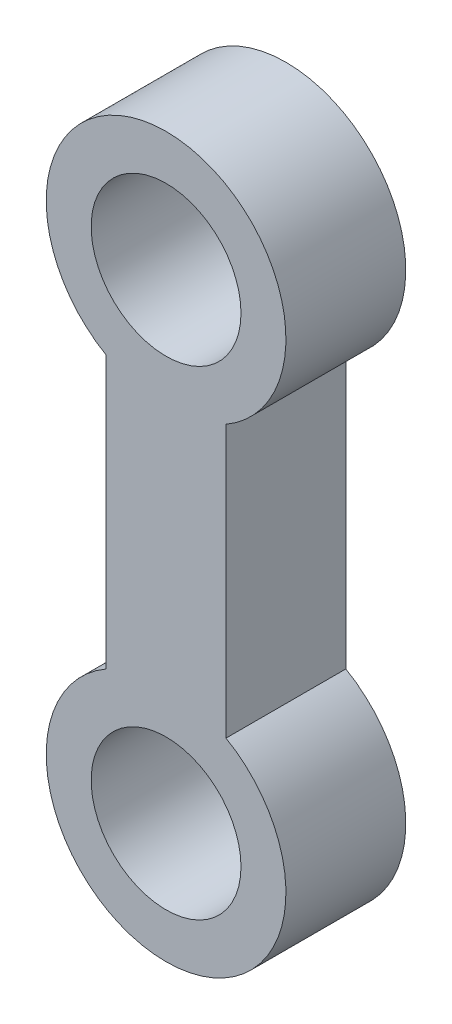
ISO-10303-21;
HEADER;
FILE_DESCRIPTION(('STEP AP214'),'2;1');
FILE_NAME('part.step','',(''),(''),'','','');
FILE_SCHEMA(('AUTOMOTIVE_DESIGN { 1 0 10303 214 1 1 1 1 }'));
ENDSEC;
DATA;
#1=APPLICATION_CONTEXT('core data for automotive mechanical design processes');
#2=APPLICATION_PROTOCOL_DEFINITION('international standard','automotive_design',2000,#1);
#3=PRODUCT_CONTEXT('',#1,'mechanical');
#4=PRODUCT('Part','Part','',(#3));
#5=PRODUCT_RELATED_PRODUCT_CATEGORY('part','',(#4));
#6=PRODUCT_DEFINITION_FORMATION('','',#4);
#7=PRODUCT_DEFINITION_CONTEXT('part definition',#1,'design');
#8=PRODUCT_DEFINITION('design','',#6,#7);
#9=PRODUCT_DEFINITION_SHAPE('','',#8);
#10=(LENGTH_UNIT() NAMED_UNIT(*) SI_UNIT(.MILLI.,.METRE.));
#11=(NAMED_UNIT(*) PLANE_ANGLE_UNIT() SI_UNIT($,.RADIAN.));
#12=(NAMED_UNIT(*) SI_UNIT($,.STERADIAN.) SOLID_ANGLE_UNIT());
#13=UNCERTAINTY_MEASURE_WITH_UNIT(LENGTH_MEASURE(1.E-05),#10,'distance_accuracy_value','');
#14=(GEOMETRIC_REPRESENTATION_CONTEXT(3) GLOBAL_UNCERTAINTY_ASSIGNED_CONTEXT((#13)) GLOBAL_UNIT_ASSIGNED_CONTEXT((#10,
#11,#12)) REPRESENTATION_CONTEXT('',''));
#15=CARTESIAN_POINT('',(0.,0.,0.));
#16=DIRECTION('',(0.,0.,1.));
#17=DIRECTION('',(1.,0.,0.));
#18=AXIS2_PLACEMENT_3D('',#15,#16,#17);
#19=CARTESIAN_POINT('',(-5.,0.,10.));
#20=DIRECTION('',(-1.,0.,0.));
#21=DIRECTION('',(0.,0.,1.));
#22=AXIS2_PLACEMENT_3D('',#19,#20,#21);
#23=PLANE('',#22);
#24=DIRECTION('',(0.,1.,0.));
#25=VECTOR('',#24,1.);
#26=CARTESIAN_POINT('',(-5.,0.,0.));
#27=LINE('',#26,#25);
#28=CARTESIAN_POINT('',(-5.,8.66025403784439,0.));
#29=VERTEX_POINT('',#28);
#30=CARTESIAN_POINT('',(-5.,31.3397459621556,0.));
#31=VERTEX_POINT('',#30);
#32=EDGE_CURVE('E114',#29,#31,#27,.T.);
#33=ORIENTED_EDGE('',*,*,#32,.F.);
#34=DIRECTION('',(0.,0.,-1.));
#35=VECTOR('',#34,1.);
#36=CARTESIAN_POINT('',(-5.,8.66025403784439,10.));
#37=LINE('',#36,#35);
#38=CARTESIAN_POINT('',(-5.,8.66025403784439,10.));
#39=VERTEX_POINT('',#38);
#40=EDGE_CURVE('E11',#39,#29,#37,.T.);
#41=ORIENTED_EDGE('',*,*,#40,.F.);
#42=DIRECTION('',(0.,1.,0.));
#43=VECTOR('',#42,1.);
#44=CARTESIAN_POINT('',(-5.,0.,10.));
#45=LINE('',#44,#43);
#46=CARTESIAN_POINT('',(-5.,31.3397459621556,10.));
#47=VERTEX_POINT('',#46);
#48=EDGE_CURVE('E98',#39,#47,#45,.T.);
#49=ORIENTED_EDGE('',*,*,#48,.T.);
#50=DIRECTION('',(0.,0.,-1.));
#51=VECTOR('',#50,1.);
#52=CARTESIAN_POINT('',(-5.,31.3397459621556,10.));
#53=LINE('',#52,#51);
#54=EDGE_CURVE('E87',#47,#31,#53,.T.);
#55=ORIENTED_EDGE('',*,*,#54,.T.);
#56=EDGE_LOOP('',(#33,#41,#49,#55));
#57=FACE_BOUND('',#56,.T.);
#58=ADVANCED_FACE('F47',(#57),#23,.T.);
#59=CARTESIAN_POINT('',(0.,0.,10.));
#60=DIRECTION('',(0.,0.,-1.));
#61=DIRECTION('',(-1.,0.,0.));
#62=AXIS2_PLACEMENT_3D('',#59,#60,#61);
#63=CYLINDRICAL_SURFACE('',#62,10.);
#64=CARTESIAN_POINT('',(0.,0.,0.));
#65=DIRECTION('',(0.,0.,1.));
#66=DIRECTION('',(1.,0.,0.));
#67=AXIS2_PLACEMENT_3D('',#64,#65,#66);
#68=CIRCLE('',#67,10.);
#69=CARTESIAN_POINT('',(5.,8.66025403784439,0.));
#70=VERTEX_POINT('',#69);
#71=EDGE_CURVE('E104',#29,#70,#68,.T.);
#72=ORIENTED_EDGE('',*,*,#71,.T.);
#73=DIRECTION('',(0.,0.,-1.));
#74=VECTOR('',#73,1.);
#75=CARTESIAN_POINT('',(5.,8.66025403784439,10.));
#76=LINE('',#75,#74);
#77=CARTESIAN_POINT('',(5.,8.66025403784439,10.));
#78=VERTEX_POINT('',#77);
#79=EDGE_CURVE('E56',#78,#70,#76,.T.);
#80=ORIENTED_EDGE('',*,*,#79,.F.);
#81=CARTESIAN_POINT('',(0.,0.,10.));
#82=DIRECTION('',(0.,0.,1.));
#83=DIRECTION('',(1.,0.,0.));
#84=AXIS2_PLACEMENT_3D('',#81,#82,#83);
#85=CIRCLE('',#84,10.);
#86=EDGE_CURVE('E93',#39,#78,#85,.T.);
#87=ORIENTED_EDGE('',*,*,#86,.F.);
#88=ORIENTED_EDGE('',*,*,#40,.T.);
#89=EDGE_LOOP('',(#72,#80,#87,#88));
#90=FACE_BOUND('',#89,.T.);
#91=ADVANCED_FACE('F102',(#90),#63,.T.);
#92=CARTESIAN_POINT('',(5.,0.,10.));
#93=DIRECTION('',(-1.,0.,0.));
#94=DIRECTION('',(0.,-1.,0.));
#95=AXIS2_PLACEMENT_3D('',#92,#93,#94);
#96=PLANE('',#95);
#97=DIRECTION('',(0.,1.,0.));
#98=VECTOR('',#97,1.);
#99=CARTESIAN_POINT('',(5.,0.,0.));
#100=LINE('',#99,#98);
#101=CARTESIAN_POINT('',(5.,31.3397459621556,0.));
#102=VERTEX_POINT('',#101);
#103=EDGE_CURVE('E80',#70,#102,#100,.T.);
#104=ORIENTED_EDGE('',*,*,#103,.T.);
#105=DIRECTION('',(0.,0.,-1.));
#106=VECTOR('',#105,1.);
#107=CARTESIAN_POINT('',(5.,31.3397459621556,10.));
#108=LINE('',#107,#106);
#109=CARTESIAN_POINT('',(5.,31.3397459621556,10.));
#110=VERTEX_POINT('',#109);
#111=EDGE_CURVE('E106',#110,#102,#108,.T.);
#112=ORIENTED_EDGE('',*,*,#111,.F.);
#113=DIRECTION('',(0.,1.,0.));
#114=VECTOR('',#113,1.);
#115=CARTESIAN_POINT('',(5.,0.,10.));
#116=LINE('',#115,#114);
#117=EDGE_CURVE('E97',#78,#110,#116,.T.);
#118=ORIENTED_EDGE('',*,*,#117,.F.);
#119=ORIENTED_EDGE('',*,*,#79,.T.);
#120=EDGE_LOOP('',(#104,#112,#118,#119));
#121=FACE_BOUND('',#120,.T.);
#122=ADVANCED_FACE('F107',(#121),#96,.F.);
#123=CARTESIAN_POINT('',(0.,40.,10.));
#124=DIRECTION('',(0.,0.,-1.));
#125=DIRECTION('',(-1.,0.,0.));
#126=AXIS2_PLACEMENT_3D('',#123,#124,#125);
#127=CYLINDRICAL_SURFACE('',#126,10.);
#128=CARTESIAN_POINT('',(0.,40.,0.));
#129=DIRECTION('',(0.,0.,1.));
#130=DIRECTION('',(1.,0.,0.));
#131=AXIS2_PLACEMENT_3D('',#128,#129,#130);
#132=CIRCLE('',#131,10.);
#133=EDGE_CURVE('E123',#102,#31,#132,.T.);
#134=ORIENTED_EDGE('',*,*,#133,.T.);
#135=ORIENTED_EDGE('',*,*,#54,.F.);
#136=CARTESIAN_POINT('',(0.,40.,10.));
#137=DIRECTION('',(0.,0.,1.));
#138=DIRECTION('',(1.,0.,0.));
#139=AXIS2_PLACEMENT_3D('',#136,#137,#138);
#140=CIRCLE('',#139,10.);
#141=EDGE_CURVE('E64',#110,#47,#140,.T.);
#142=ORIENTED_EDGE('',*,*,#141,.F.);
#143=ORIENTED_EDGE('',*,*,#111,.T.);
#144=EDGE_LOOP('',(#134,#135,#142,#143));
#145=FACE_BOUND('',#144,.T.);
#146=ADVANCED_FACE('F131',(#145),#127,.T.);
#147=CARTESIAN_POINT('',(0.,0.,10.));
#148=DIRECTION('',(0.,0.,1.));
#149=DIRECTION('',(1.,0.,0.));
#150=AXIS2_PLACEMENT_3D('',#147,#148,#149);
#151=PLANE('',#150);
#152=CARTESIAN_POINT('',(0.,40.,10.));
#153=DIRECTION('',(0.,0.,1.));
#154=DIRECTION('',(1.,0.,0.));
#155=AXIS2_PLACEMENT_3D('',#152,#153,#154);
#156=CIRCLE('',#155,6.25);
#157=CARTESIAN_POINT('',(6.25,40.,10.));
#158=VERTEX_POINT('',#157);
#159=EDGE_CURVE('E165',#158,#158,#156,.T.);
#160=ORIENTED_EDGE('',*,*,#159,.F.);
#161=EDGE_LOOP('',(#160));
#162=FACE_BOUND('',#161,.T.);
#163=CARTESIAN_POINT('',(0.,0.,10.));
#164=DIRECTION('',(0.,0.,1.));
#165=DIRECTION('',(1.,0.,0.));
#166=AXIS2_PLACEMENT_3D('',#163,#164,#165);
#167=CIRCLE('',#166,6.25);
#168=CARTESIAN_POINT('',(6.25,0.,10.));
#169=VERTEX_POINT('',#168);
#170=EDGE_CURVE('E167',#169,#169,#167,.T.);
#171=ORIENTED_EDGE('',*,*,#170,.F.);
#172=EDGE_LOOP('',(#171));
#173=FACE_BOUND('',#172,.T.);
#174=ORIENTED_EDGE('',*,*,#48,.F.);
#175=ORIENTED_EDGE('',*,*,#86,.T.);
#176=ORIENTED_EDGE('',*,*,#117,.T.);
#177=ORIENTED_EDGE('',*,*,#141,.T.);
#178=EDGE_LOOP('',(#174,#175,#176,#177));
#179=FACE_BOUND('',#178,.T.);
#180=ADVANCED_FACE('F95',(#162,#173,#179),#151,.T.);
#181=CARTESIAN_POINT('',(0.,0.,0.));
#182=DIRECTION('',(0.,0.,1.));
#183=DIRECTION('',(1.,0.,0.));
#184=AXIS2_PLACEMENT_3D('',#181,#182,#183);
#185=PLANE('',#184);
#186=CARTESIAN_POINT('',(0.,40.,0.));
#187=DIRECTION('',(0.,0.,1.));
#188=DIRECTION('',(1.,0.,0.));
#189=AXIS2_PLACEMENT_3D('',#186,#187,#188);
#190=CIRCLE('',#189,6.25);
#191=CARTESIAN_POINT('',(6.25,40.,0.));
#192=VERTEX_POINT('',#191);
#193=EDGE_CURVE('E118',#192,#192,#190,.T.);
#194=ORIENTED_EDGE('',*,*,#193,.T.);
#195=EDGE_LOOP('',(#194));
#196=FACE_BOUND('',#195,.T.);
#197=CARTESIAN_POINT('',(0.,0.,0.));
#198=DIRECTION('',(0.,0.,1.));
#199=DIRECTION('',(1.,0.,0.));
#200=AXIS2_PLACEMENT_3D('',#197,#198,#199);
#201=CIRCLE('',#200,6.25);
#202=CARTESIAN_POINT('',(6.25,0.,0.));
#203=VERTEX_POINT('',#202);
#204=EDGE_CURVE('E173',#203,#203,#201,.T.);
#205=ORIENTED_EDGE('',*,*,#204,.T.);
#206=EDGE_LOOP('',(#205));
#207=FACE_BOUND('',#206,.T.);
#208=ORIENTED_EDGE('',*,*,#32,.T.);
#209=ORIENTED_EDGE('',*,*,#133,.F.);
#210=ORIENTED_EDGE('',*,*,#103,.F.);
#211=ORIENTED_EDGE('',*,*,#71,.F.);
#212=EDGE_LOOP('',(#208,#209,#210,#211));
#213=FACE_BOUND('',#212,.T.);
#214=ADVANCED_FACE('F133',(#196,#207,#213),#185,.F.);
#215=CARTESIAN_POINT('',(0.,0.,0.));
#216=DIRECTION('',(0.,0.,1.));
#217=DIRECTION('',(1.,0.,0.));
#218=AXIS2_PLACEMENT_3D('',#215,#216,#217);
#219=CYLINDRICAL_SURFACE('',#218,6.25);
#220=ORIENTED_EDGE('',*,*,#204,.F.);
#221=EDGE_LOOP('',(#220));
#222=FACE_BOUND('',#221,.T.);
#223=ORIENTED_EDGE('',*,*,#170,.T.);
#224=EDGE_LOOP('',(#223));
#225=FACE_BOUND('',#224,.T.);
#226=ADVANCED_FACE('F147',(#222,#225),#219,.F.);
#227=CARTESIAN_POINT('',(0.,40.,0.));
#228=DIRECTION('',(0.,0.,1.));
#229=DIRECTION('',(1.,0.,0.));
#230=AXIS2_PLACEMENT_3D('',#227,#228,#229);
#231=CYLINDRICAL_SURFACE('',#230,6.25);
#232=ORIENTED_EDGE('',*,*,#193,.F.);
#233=EDGE_LOOP('',(#232));
#234=FACE_BOUND('',#233,.T.);
#235=ORIENTED_EDGE('',*,*,#159,.T.);
#236=EDGE_LOOP('',(#235));
#237=FACE_BOUND('',#236,.T.);
#238=ADVANCED_FACE('F154',(#234,#237),#231,.F.);
#239=CLOSED_SHELL('',(#58,#91,#122,#146,#180,#214,#226,#238));
#240=MANIFOLD_SOLID_BREP('B2',#239);
#241=ADVANCED_BREP_SHAPE_REPRESENTATION('',(#18,#240),#14);
#242=SHAPE_DEFINITION_REPRESENTATION(#9,#241);
ENDSEC;
END-ISO-10303-21;
